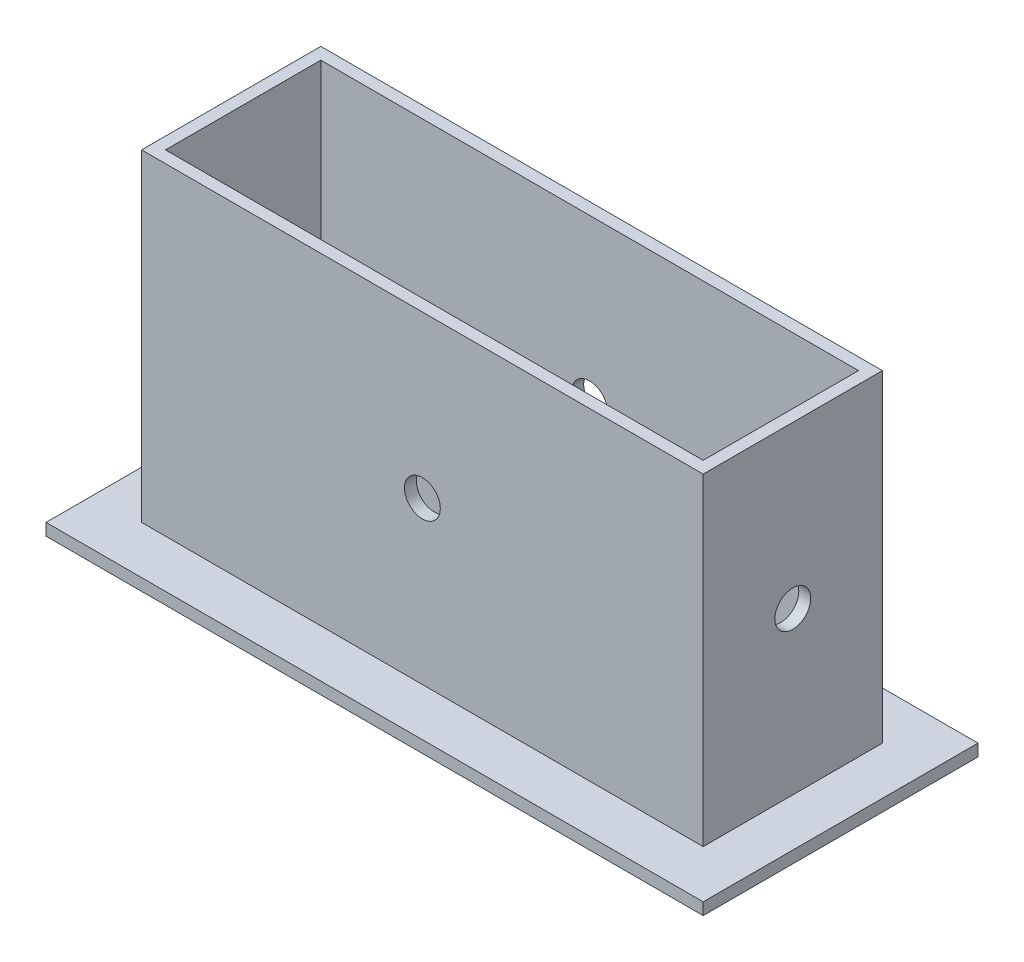
ISO-10303-21;
HEADER;
FILE_DESCRIPTION(('STEP AP214'),'2;1');
FILE_NAME('part.step','',(''),(''),'','','');
FILE_SCHEMA(('AUTOMOTIVE_DESIGN { 1 0 10303 214 1 1 1 1 }'));
ENDSEC;
DATA;
#1=APPLICATION_CONTEXT('core data for automotive mechanical design processes');
#2=APPLICATION_PROTOCOL_DEFINITION('international standard','automotive_design',2000,#1);
#3=PRODUCT_CONTEXT('',#1,'mechanical');
#4=PRODUCT('Part','Part','',(#3));
#5=PRODUCT_RELATED_PRODUCT_CATEGORY('part','',(#4));
#6=PRODUCT_DEFINITION_FORMATION('','',#4);
#7=PRODUCT_DEFINITION_CONTEXT('part definition',#1,'design');
#8=PRODUCT_DEFINITION('design','',#6,#7);
#9=PRODUCT_DEFINITION_SHAPE('','',#8);
#10=(LENGTH_UNIT() NAMED_UNIT(*) SI_UNIT(.MILLI.,.METRE.));
#11=(NAMED_UNIT(*) PLANE_ANGLE_UNIT() SI_UNIT($,.RADIAN.));
#12=(NAMED_UNIT(*) SI_UNIT($,.STERADIAN.) SOLID_ANGLE_UNIT());
#13=UNCERTAINTY_MEASURE_WITH_UNIT(LENGTH_MEASURE(1.E-05),#10,'distance_accuracy_value','');
#14=(GEOMETRIC_REPRESENTATION_CONTEXT(3) GLOBAL_UNCERTAINTY_ASSIGNED_CONTEXT((#13)) GLOBAL_UNIT_ASSIGNED_CONTEXT((#10,
#11,#12)) REPRESENTATION_CONTEXT('',''));
#15=CARTESIAN_POINT('',(0.,0.,0.));
#16=DIRECTION('',(0.,0.,1.));
#17=DIRECTION('',(1.,0.,0.));
#18=AXIS2_PLACEMENT_3D('',#15,#16,#17);
#19=CARTESIAN_POINT('',(-23.5,13.5,15.));
#20=DIRECTION('',(1.,0.,0.));
#21=DIRECTION('',(0.,1.,0.));
#22=AXIS2_PLACEMENT_3D('',#19,#20,#21);
#23=PLANE('',#22);
#24=CARTESIAN_POINT('',(-23.5,0.,7.5));
#25=DIRECTION('',(-1.,0.,0.));
#26=DIRECTION('',(0.,-1.,0.));
#27=AXIS2_PLACEMENT_3D('',#24,#25,#26);
#28=CIRCLE('',#27,1.5);
#29=CARTESIAN_POINT('',(-23.5,-1.5,7.5));
#30=VERTEX_POINT('',#29);
#31=EDGE_CURVE('E314',#30,#30,#28,.T.);
#32=ORIENTED_EDGE('',*,*,#31,.F.);
#33=EDGE_LOOP('',(#32));
#34=FACE_BOUND('',#33,.T.);
#35=DIRECTION('',(0.,-1.,0.));
#36=VECTOR('',#35,1.);
#37=CARTESIAN_POINT('',(-23.5,13.5,0.));
#38=LINE('',#37,#36);
#39=CARTESIAN_POINT('',(-23.5,13.5,0.));
#40=VERTEX_POINT('',#39);
#41=CARTESIAN_POINT('',(-23.5,-13.5,0.));
#42=VERTEX_POINT('',#41);
#43=EDGE_CURVE('E146',#40,#42,#38,.T.);
#44=ORIENTED_EDGE('',*,*,#43,.T.);
#45=DIRECTION('',(0.,0.,-1.));
#46=VECTOR('',#45,1.);
#47=CARTESIAN_POINT('',(-23.5,-13.5,15.));
#48=LINE('',#47,#46);
#49=CARTESIAN_POINT('',(-23.5,-13.5,15.));
#50=VERTEX_POINT('',#49);
#51=EDGE_CURVE('E11',#50,#42,#48,.T.);
#52=ORIENTED_EDGE('',*,*,#51,.F.);
#53=DIRECTION('',(0.,-1.,0.));
#54=VECTOR('',#53,1.);
#55=CARTESIAN_POINT('',(-23.5,13.5,15.));
#56=LINE('',#55,#54);
#57=CARTESIAN_POINT('',(-23.5,13.5,15.));
#58=VERTEX_POINT('',#57);
#59=EDGE_CURVE('E87',#58,#50,#56,.T.);
#60=ORIENTED_EDGE('',*,*,#59,.F.);
#61=DIRECTION('',(0.,0.,-1.));
#62=VECTOR('',#61,1.);
#63=CARTESIAN_POINT('',(-23.5,13.5,15.));
#64=LINE('',#63,#62);
#65=EDGE_CURVE('E242',#58,#40,#64,.T.);
#66=ORIENTED_EDGE('',*,*,#65,.T.);
#67=EDGE_LOOP('',(#44,#52,#60,#66));
#68=FACE_BOUND('',#67,.T.);
#69=ADVANCED_FACE('F38',(#34,#68),#23,.F.);
#70=CARTESIAN_POINT('',(23.5,13.5,15.));
#71=DIRECTION('',(-1.,0.,0.));
#72=DIRECTION('',(0.,-1.,0.));
#73=AXIS2_PLACEMENT_3D('',#70,#71,#72);
#74=PLANE('',#73);
#75=CARTESIAN_POINT('',(23.5,0.,7.5));
#76=DIRECTION('',(-1.,0.,0.));
#77=DIRECTION('',(0.,-1.,0.));
#78=AXIS2_PLACEMENT_3D('',#75,#76,#77);
#79=CIRCLE('',#78,1.5);
#80=CARTESIAN_POINT('',(23.5,-1.5,7.5));
#81=VERTEX_POINT('',#80);
#82=EDGE_CURVE('E433',#81,#81,#79,.T.);
#83=ORIENTED_EDGE('',*,*,#82,.T.);
#84=EDGE_LOOP('',(#83));
#85=FACE_BOUND('',#84,.T.);
#86=DIRECTION('',(0.,1.,0.));
#87=VECTOR('',#86,1.);
#88=CARTESIAN_POINT('',(23.5,13.5,0.));
#89=LINE('',#88,#87);
#90=CARTESIAN_POINT('',(23.5,-13.5,0.));
#91=VERTEX_POINT('',#90);
#92=CARTESIAN_POINT('',(23.5,13.5,0.));
#93=VERTEX_POINT('',#92);
#94=EDGE_CURVE('E249',#91,#93,#89,.T.);
#95=ORIENTED_EDGE('',*,*,#94,.T.);
#96=DIRECTION('',(0.,0.,-1.));
#97=VECTOR('',#96,1.);
#98=CARTESIAN_POINT('',(23.5,13.5,15.));
#99=LINE('',#98,#97);
#100=CARTESIAN_POINT('',(23.5,13.5,15.));
#101=VERTEX_POINT('',#100);
#102=EDGE_CURVE('E256',#101,#93,#99,.T.);
#103=ORIENTED_EDGE('',*,*,#102,.F.);
#104=DIRECTION('',(0.,1.,0.));
#105=VECTOR('',#104,1.);
#106=CARTESIAN_POINT('',(23.5,13.5,15.));
#107=LINE('',#106,#105);
#108=CARTESIAN_POINT('',(23.5,-13.5,15.));
#109=VERTEX_POINT('',#108);
#110=EDGE_CURVE('E237',#109,#101,#107,.T.);
#111=ORIENTED_EDGE('',*,*,#110,.F.);
#112=DIRECTION('',(0.,0.,-1.));
#113=VECTOR('',#112,1.);
#114=CARTESIAN_POINT('',(23.5,-13.5,15.));
#115=LINE('',#114,#113);
#116=EDGE_CURVE('E47',#109,#91,#115,.T.);
#117=ORIENTED_EDGE('',*,*,#116,.T.);
#118=EDGE_LOOP('',(#95,#103,#111,#117));
#119=FACE_BOUND('',#118,.T.);
#120=ADVANCED_FACE('F304',(#85,#119),#74,.F.);
#121=CARTESIAN_POINT('',(-23.5,13.5,15.));
#122=DIRECTION('',(0.,-1.,0.));
#123=DIRECTION('',(1.,0.,0.));
#124=AXIS2_PLACEMENT_3D('',#121,#122,#123);
#125=PLANE('',#124);
#126=DIRECTION('',(1.,0.,0.));
#127=VECTOR('',#126,1.);
#128=CARTESIAN_POINT('',(-22.5,13.5,14.));
#129=LINE('',#128,#127);
#130=CARTESIAN_POINT('',(-22.5,13.5,14.));
#131=VERTEX_POINT('',#130);
#132=CARTESIAN_POINT('',(22.5,13.5,14.));
#133=VERTEX_POINT('',#132);
#134=EDGE_CURVE('E215',#131,#133,#129,.T.);
#135=ORIENTED_EDGE('',*,*,#134,.F.);
#136=DIRECTION('',(0.,0.,1.));
#137=VECTOR('',#136,1.);
#138=CARTESIAN_POINT('',(-22.5,13.5,1.));
#139=LINE('',#138,#137);
#140=CARTESIAN_POINT('',(-22.5,13.5,1.));
#141=VERTEX_POINT('',#140);
#142=EDGE_CURVE('E55',#141,#131,#139,.T.);
#143=ORIENTED_EDGE('',*,*,#142,.F.);
#144=DIRECTION('',(-1.,0.,0.));
#145=VECTOR('',#144,1.);
#146=CARTESIAN_POINT('',(-22.5,13.5,1.));
#147=LINE('',#146,#145);
#148=CARTESIAN_POINT('',(22.5,13.5,1.));
#149=VERTEX_POINT('',#148);
#150=EDGE_CURVE('E144',#149,#141,#147,.T.);
#151=ORIENTED_EDGE('',*,*,#150,.F.);
#152=DIRECTION('',(0.,0.,-1.));
#153=VECTOR('',#152,1.);
#154=CARTESIAN_POINT('',(22.5,13.5,1.));
#155=LINE('',#154,#153);
#156=EDGE_CURVE('E219',#133,#149,#155,.T.);
#157=ORIENTED_EDGE('',*,*,#156,.F.);
#158=EDGE_LOOP('',(#135,#143,#151,#157));
#159=FACE_BOUND('',#158,.T.);
#160=DIRECTION('',(-1.,0.,0.));
#161=VECTOR('',#160,1.);
#162=CARTESIAN_POINT('',(-23.5,13.5,0.));
#163=LINE('',#162,#161);
#164=EDGE_CURVE('E82',#93,#40,#163,.T.);
#165=ORIENTED_EDGE('',*,*,#164,.T.);
#166=ORIENTED_EDGE('',*,*,#65,.F.);
#167=DIRECTION('',(-1.,0.,0.));
#168=VECTOR('',#167,1.);
#169=CARTESIAN_POINT('',(-23.5,13.5,15.));
#170=LINE('',#169,#168);
#171=EDGE_CURVE('E64',#101,#58,#170,.T.);
#172=ORIENTED_EDGE('',*,*,#171,.F.);
#173=ORIENTED_EDGE('',*,*,#102,.T.);
#174=EDGE_LOOP('',(#165,#166,#172,#173));
#175=FACE_BOUND('',#174,.T.);
#176=ADVANCED_FACE('F309',(#159,#175),#125,.F.);
#177=CARTESIAN_POINT('',(0.,0.,15.));
#178=DIRECTION('',(0.,0.,1.));
#179=DIRECTION('',(1.,0.,0.));
#180=AXIS2_PLACEMENT_3D('',#177,#178,#179);
#181=PLANE('',#180);
#182=CARTESIAN_POINT('',(0.,0.,15.));
#183=DIRECTION('',(0.,0.,1.));
#184=DIRECTION('',(1.,0.,0.));
#185=AXIS2_PLACEMENT_3D('',#182,#183,#184);
#186=CIRCLE('',#185,1.5);
#187=CARTESIAN_POINT('',(1.5,0.,15.));
#188=VERTEX_POINT('',#187);
#189=EDGE_CURVE('E264',#188,#188,#186,.T.);
#190=ORIENTED_EDGE('',*,*,#189,.F.);
#191=EDGE_LOOP('',(#190));
#192=FACE_BOUND('',#191,.T.);
#193=ORIENTED_EDGE('',*,*,#59,.T.);
#194=DIRECTION('',(1.,0.,0.));
#195=VECTOR('',#194,1.);
#196=CARTESIAN_POINT('',(-23.5,-13.5,15.));
#197=LINE('',#196,#195);
#198=EDGE_CURVE('E234',#50,#109,#197,.T.);
#199=ORIENTED_EDGE('',*,*,#198,.T.);
#200=ORIENTED_EDGE('',*,*,#110,.T.);
#201=ORIENTED_EDGE('',*,*,#171,.T.);
#202=EDGE_LOOP('',(#193,#199,#200,#201));
#203=FACE_BOUND('',#202,.T.);
#204=ADVANCED_FACE('F323',(#192,#203),#181,.T.);
#205=CARTESIAN_POINT('',(0.,0.,0.));
#206=DIRECTION('',(0.,0.,1.));
#207=DIRECTION('',(1.,0.,0.));
#208=AXIS2_PLACEMENT_3D('',#205,#206,#207);
#209=PLANE('',#208);
#210=CARTESIAN_POINT('',(0.,0.,0.));
#211=DIRECTION('',(0.,0.,1.));
#212=DIRECTION('',(1.,0.,0.));
#213=AXIS2_PLACEMENT_3D('',#210,#211,#212);
#214=CIRCLE('',#213,1.5);
#215=CARTESIAN_POINT('',(1.5,0.,0.));
#216=VERTEX_POINT('',#215);
#217=EDGE_CURVE('E157',#216,#216,#214,.T.);
#218=ORIENTED_EDGE('',*,*,#217,.T.);
#219=EDGE_LOOP('',(#218));
#220=FACE_BOUND('',#219,.T.);
#221=ORIENTED_EDGE('',*,*,#43,.F.);
#222=ORIENTED_EDGE('',*,*,#164,.F.);
#223=ORIENTED_EDGE('',*,*,#94,.F.);
#224=DIRECTION('',(1.,0.,0.));
#225=VECTOR('',#224,1.);
#226=CARTESIAN_POINT('',(-23.5,-13.5,0.));
#227=LINE('',#226,#225);
#228=EDGE_CURVE('E245',#42,#91,#227,.T.);
#229=ORIENTED_EDGE('',*,*,#228,.F.);
#230=EDGE_LOOP('',(#221,#222,#223,#229));
#231=FACE_BOUND('',#230,.T.);
#232=ADVANCED_FACE('F284',(#220,#231),#209,.F.);
#233=CARTESIAN_POINT('',(-22.5,-13.5,1.));
#234=DIRECTION('',(-1.,0.,0.));
#235=DIRECTION('',(0.,-1.,0.));
#236=AXIS2_PLACEMENT_3D('',#233,#234,#235);
#237=PLANE('',#236);
#238=CARTESIAN_POINT('',(-22.5,0.,7.5));
#239=DIRECTION('',(-1.,0.,0.));
#240=DIRECTION('',(0.,-1.,0.));
#241=AXIS2_PLACEMENT_3D('',#238,#239,#240);
#242=CIRCLE('',#241,1.5);
#243=CARTESIAN_POINT('',(-22.5,-1.5,7.5));
#244=VERTEX_POINT('',#243);
#245=EDGE_CURVE('E272',#244,#244,#242,.T.);
#246=ORIENTED_EDGE('',*,*,#245,.T.);
#247=EDGE_LOOP('',(#246));
#248=FACE_BOUND('',#247,.T.);
#249=ORIENTED_EDGE('',*,*,#142,.T.);
#250=DIRECTION('',(0.,1.,0.));
#251=VECTOR('',#250,1.);
#252=CARTESIAN_POINT('',(-22.5,-13.5,14.));
#253=LINE('',#252,#251);
#254=CARTESIAN_POINT('',(-22.5,-14.5,14.));
#255=VERTEX_POINT('',#254);
#256=EDGE_CURVE('E152',#255,#131,#253,.T.);
#257=ORIENTED_EDGE('',*,*,#256,.F.);
#258=DIRECTION('',(0.,0.,-1.));
#259=VECTOR('',#258,1.);
#260=CARTESIAN_POINT('',(-22.5,-14.5,14.));
#261=LINE('',#260,#259);
#262=CARTESIAN_POINT('',(-22.5,-14.5,1.));
#263=VERTEX_POINT('',#262);
#264=EDGE_CURVE('E150',#255,#263,#261,.T.);
#265=ORIENTED_EDGE('',*,*,#264,.T.);
#266=DIRECTION('',(0.,1.,0.));
#267=VECTOR('',#266,1.);
#268=CARTESIAN_POINT('',(-22.5,-13.5,1.));
#269=LINE('',#268,#267);
#270=EDGE_CURVE('E137',#263,#141,#269,.T.);
#271=ORIENTED_EDGE('',*,*,#270,.T.);
#272=EDGE_LOOP('',(#249,#257,#265,#271));
#273=FACE_BOUND('',#272,.T.);
#274=ADVANCED_FACE('F151',(#248,#273),#237,.F.);
#275=CARTESIAN_POINT('',(-22.5,-13.5,1.));
#276=DIRECTION('',(0.,0.,-1.));
#277=DIRECTION('',(-1.,0.,0.));
#278=AXIS2_PLACEMENT_3D('',#275,#276,#277);
#279=PLANE('',#278);
#280=CARTESIAN_POINT('',(0.,0.,1.));
#281=DIRECTION('',(0.,0.,-1.));
#282=DIRECTION('',(-1.,0.,0.));
#283=AXIS2_PLACEMENT_3D('',#280,#281,#282);
#284=CIRCLE('',#283,1.5);
#285=CARTESIAN_POINT('',(-1.5,0.,1.));
#286=VERTEX_POINT('',#285);
#287=EDGE_CURVE('E263',#286,#286,#284,.T.);
#288=ORIENTED_EDGE('',*,*,#287,.T.);
#289=EDGE_LOOP('',(#288));
#290=FACE_BOUND('',#289,.T.);
#291=ORIENTED_EDGE('',*,*,#150,.T.);
#292=ORIENTED_EDGE('',*,*,#270,.F.);
#293=DIRECTION('',(1.,0.,0.));
#294=VECTOR('',#293,1.);
#295=CARTESIAN_POINT('',(-22.5,-14.5,1.));
#296=LINE('',#295,#294);
#297=CARTESIAN_POINT('',(22.5,-14.5,1.));
#298=VERTEX_POINT('',#297);
#299=EDGE_CURVE('E141',#263,#298,#296,.T.);
#300=ORIENTED_EDGE('',*,*,#299,.T.);
#301=DIRECTION('',(0.,1.,0.));
#302=VECTOR('',#301,1.);
#303=CARTESIAN_POINT('',(22.5,-13.5,1.));
#304=LINE('',#303,#302);
#305=EDGE_CURVE('E147',#298,#149,#304,.T.);
#306=ORIENTED_EDGE('',*,*,#305,.T.);
#307=EDGE_LOOP('',(#291,#292,#300,#306));
#308=FACE_BOUND('',#307,.T.);
#309=ADVANCED_FACE('F139',(#290,#308),#279,.F.);
#310=CARTESIAN_POINT('',(22.5,-13.5,1.));
#311=DIRECTION('',(1.,0.,0.));
#312=DIRECTION('',(0.,1.,0.));
#313=AXIS2_PLACEMENT_3D('',#310,#311,#312);
#314=PLANE('',#313);
#315=CARTESIAN_POINT('',(22.5,0.,7.5));
#316=DIRECTION('',(1.,0.,0.));
#317=DIRECTION('',(0.,1.,0.));
#318=AXIS2_PLACEMENT_3D('',#315,#316,#317);
#319=CIRCLE('',#318,1.5);
#320=CARTESIAN_POINT('',(22.5,1.5,7.5));
#321=VERTEX_POINT('',#320);
#322=EDGE_CURVE('E41',#321,#321,#319,.T.);
#323=ORIENTED_EDGE('',*,*,#322,.T.);
#324=EDGE_LOOP('',(#323));
#325=FACE_BOUND('',#324,.T.);
#326=ORIENTED_EDGE('',*,*,#156,.T.);
#327=ORIENTED_EDGE('',*,*,#305,.F.);
#328=DIRECTION('',(0.,0.,1.));
#329=VECTOR('',#328,1.);
#330=CARTESIAN_POINT('',(22.5,-14.5,14.));
#331=LINE('',#330,#329);
#332=CARTESIAN_POINT('',(22.5,-14.5,14.));
#333=VERTEX_POINT('',#332);
#334=EDGE_CURVE('E161',#298,#333,#331,.T.);
#335=ORIENTED_EDGE('',*,*,#334,.T.);
#336=DIRECTION('',(0.,1.,0.));
#337=VECTOR('',#336,1.);
#338=CARTESIAN_POINT('',(22.5,-13.5,14.));
#339=LINE('',#338,#337);
#340=EDGE_CURVE('E227',#333,#133,#339,.T.);
#341=ORIENTED_EDGE('',*,*,#340,.T.);
#342=EDGE_LOOP('',(#326,#327,#335,#341));
#343=FACE_BOUND('',#342,.T.);
#344=ADVANCED_FACE('F346',(#325,#343),#314,.F.);
#345=CARTESIAN_POINT('',(-22.5,-13.5,14.));
#346=DIRECTION('',(0.,0.,1.));
#347=DIRECTION('',(1.,0.,0.));
#348=AXIS2_PLACEMENT_3D('',#345,#346,#347);
#349=PLANE('',#348);
#350=CARTESIAN_POINT('',(0.,0.,14.));
#351=DIRECTION('',(0.,0.,1.));
#352=DIRECTION('',(1.,0.,0.));
#353=AXIS2_PLACEMENT_3D('',#350,#351,#352);
#354=CIRCLE('',#353,1.5);
#355=CARTESIAN_POINT('',(1.5,0.,14.));
#356=VERTEX_POINT('',#355);
#357=EDGE_CURVE('E260',#356,#356,#354,.T.);
#358=ORIENTED_EDGE('',*,*,#357,.T.);
#359=EDGE_LOOP('',(#358));
#360=FACE_BOUND('',#359,.T.);
#361=ORIENTED_EDGE('',*,*,#134,.T.);
#362=ORIENTED_EDGE('',*,*,#340,.F.);
#363=DIRECTION('',(-1.,0.,0.));
#364=VECTOR('',#363,1.);
#365=CARTESIAN_POINT('',(-22.5,-14.5,14.));
#366=LINE('',#365,#364);
#367=EDGE_CURVE('E165',#333,#255,#366,.T.);
#368=ORIENTED_EDGE('',*,*,#367,.T.);
#369=ORIENTED_EDGE('',*,*,#256,.T.);
#370=EDGE_LOOP('',(#361,#362,#368,#369));
#371=FACE_BOUND('',#370,.T.);
#372=ADVANCED_FACE('F343',(#360,#371),#349,.F.);
#373=CARTESIAN_POINT('',(0.,-13.5,0.));
#374=DIRECTION('',(0.,-1.,0.));
#375=DIRECTION('',(1.,0.,0.));
#376=AXIS2_PLACEMENT_3D('',#373,#374,#375);
#377=PLANE('',#376);
#378=DIRECTION('',(0.,0.,-1.));
#379=VECTOR('',#378,1.);
#380=CARTESIAN_POINT('',(-27.5,-13.5,19.));
#381=LINE('',#380,#379);
#382=CARTESIAN_POINT('',(-27.5,-13.5,19.));
#383=VERTEX_POINT('',#382);
#384=CARTESIAN_POINT('',(-27.5,-13.5,-4.));
#385=VERTEX_POINT('',#384);
#386=EDGE_CURVE('E171',#383,#385,#381,.T.);
#387=ORIENTED_EDGE('',*,*,#386,.F.);
#388=DIRECTION('',(-1.,0.,0.));
#389=VECTOR('',#388,1.);
#390=CARTESIAN_POINT('',(-27.5,-13.5,19.));
#391=LINE('',#390,#389);
#392=CARTESIAN_POINT('',(27.5,-13.5,19.));
#393=VERTEX_POINT('',#392);
#394=EDGE_CURVE('E177',#393,#383,#391,.T.);
#395=ORIENTED_EDGE('',*,*,#394,.F.);
#396=DIRECTION('',(0.,0.,1.));
#397=VECTOR('',#396,1.);
#398=CARTESIAN_POINT('',(27.5,-13.5,19.));
#399=LINE('',#398,#397);
#400=CARTESIAN_POINT('',(27.5,-13.5,-4.));
#401=VERTEX_POINT('',#400);
#402=EDGE_CURVE('E193',#401,#393,#399,.T.);
#403=ORIENTED_EDGE('',*,*,#402,.F.);
#404=DIRECTION('',(1.,0.,0.));
#405=VECTOR('',#404,1.);
#406=CARTESIAN_POINT('',(-27.5,-13.5,-4.));
#407=LINE('',#406,#405);
#408=EDGE_CURVE('E190',#385,#401,#407,.T.);
#409=ORIENTED_EDGE('',*,*,#408,.F.);
#410=EDGE_LOOP('',(#387,#395,#403,#409));
#411=FACE_BOUND('',#410,.T.);
#412=ORIENTED_EDGE('',*,*,#51,.T.);
#413=ORIENTED_EDGE('',*,*,#228,.T.);
#414=ORIENTED_EDGE('',*,*,#116,.F.);
#415=ORIENTED_EDGE('',*,*,#198,.F.);
#416=EDGE_LOOP('',(#412,#413,#414,#415));
#417=FACE_BOUND('',#416,.T.);
#418=ADVANCED_FACE('F321',(#411,#417),#377,.F.);
#419=CARTESIAN_POINT('',(0.,-14.5,0.));
#420=DIRECTION('',(0.,-1.,0.));
#421=DIRECTION('',(1.,0.,0.));
#422=AXIS2_PLACEMENT_3D('',#419,#420,#421);
#423=PLANE('',#422);
#424=DIRECTION('',(0.,0.,-1.));
#425=VECTOR('',#424,1.);
#426=CARTESIAN_POINT('',(-27.5,-14.5,19.));
#427=LINE('',#426,#425);
#428=CARTESIAN_POINT('',(-27.5,-14.5,19.));
#429=VERTEX_POINT('',#428);
#430=CARTESIAN_POINT('',(-27.5,-14.5,-4.));
#431=VERTEX_POINT('',#430);
#432=EDGE_CURVE('E172',#429,#431,#427,.T.);
#433=ORIENTED_EDGE('',*,*,#432,.T.);
#434=DIRECTION('',(1.,0.,0.));
#435=VECTOR('',#434,1.);
#436=CARTESIAN_POINT('',(-27.5,-14.5,-4.));
#437=LINE('',#436,#435);
#438=CARTESIAN_POINT('',(27.5,-14.5,-4.));
#439=VERTEX_POINT('',#438);
#440=EDGE_CURVE('E176',#431,#439,#437,.T.);
#441=ORIENTED_EDGE('',*,*,#440,.T.);
#442=DIRECTION('',(0.,0.,1.));
#443=VECTOR('',#442,1.);
#444=CARTESIAN_POINT('',(27.5,-14.5,19.));
#445=LINE('',#444,#443);
#446=CARTESIAN_POINT('',(27.5,-14.5,19.));
#447=VERTEX_POINT('',#446);
#448=EDGE_CURVE('E180',#439,#447,#445,.T.);
#449=ORIENTED_EDGE('',*,*,#448,.T.);
#450=DIRECTION('',(-1.,0.,0.));
#451=VECTOR('',#450,1.);
#452=CARTESIAN_POINT('',(-27.5,-14.5,19.));
#453=LINE('',#452,#451);
#454=EDGE_CURVE('E183',#447,#429,#453,.T.);
#455=ORIENTED_EDGE('',*,*,#454,.T.);
#456=EDGE_LOOP('',(#433,#441,#449,#455));
#457=FACE_BOUND('',#456,.T.);
#458=ORIENTED_EDGE('',*,*,#299,.F.);
#459=ORIENTED_EDGE('',*,*,#264,.F.);
#460=ORIENTED_EDGE('',*,*,#367,.F.);
#461=ORIENTED_EDGE('',*,*,#334,.F.);
#462=EDGE_LOOP('',(#458,#459,#460,#461));
#463=FACE_BOUND('',#462,.T.);
#464=ADVANCED_FACE('F159',(#457,#463),#423,.T.);
#465=CARTESIAN_POINT('',(-27.5,-14.5,19.));
#466=DIRECTION('',(1.,0.,0.));
#467=DIRECTION('',(0.,0.,-1.));
#468=AXIS2_PLACEMENT_3D('',#465,#466,#467);
#469=PLANE('',#468);
#470=ORIENTED_EDGE('',*,*,#386,.T.);
#471=DIRECTION('',(0.,1.,0.));
#472=VECTOR('',#471,1.);
#473=CARTESIAN_POINT('',(-27.5,-14.5,-4.));
#474=LINE('',#473,#472);
#475=EDGE_CURVE('E209',#431,#385,#474,.T.);
#476=ORIENTED_EDGE('',*,*,#475,.F.);
#477=ORIENTED_EDGE('',*,*,#432,.F.);
#478=DIRECTION('',(0.,1.,0.));
#479=VECTOR('',#478,1.);
#480=CARTESIAN_POINT('',(-27.5,-14.5,19.));
#481=LINE('',#480,#479);
#482=EDGE_CURVE('E186',#429,#383,#481,.T.);
#483=ORIENTED_EDGE('',*,*,#482,.T.);
#484=EDGE_LOOP('',(#470,#476,#477,#483));
#485=FACE_BOUND('',#484,.T.);
#486=ADVANCED_FACE('F353',(#485),#469,.F.);
#487=CARTESIAN_POINT('',(-27.5,-14.5,-4.));
#488=DIRECTION('',(0.,0.,1.));
#489=DIRECTION('',(1.,0.,0.));
#490=AXIS2_PLACEMENT_3D('',#487,#488,#489);
#491=PLANE('',#490);
#492=ORIENTED_EDGE('',*,*,#408,.T.);
#493=DIRECTION('',(0.,1.,0.));
#494=VECTOR('',#493,1.);
#495=CARTESIAN_POINT('',(27.5,-14.5,-4.));
#496=LINE('',#495,#494);
#497=EDGE_CURVE('E205',#439,#401,#496,.T.);
#498=ORIENTED_EDGE('',*,*,#497,.F.);
#499=ORIENTED_EDGE('',*,*,#440,.F.);
#500=ORIENTED_EDGE('',*,*,#475,.T.);
#501=EDGE_LOOP('',(#492,#498,#499,#500));
#502=FACE_BOUND('',#501,.T.);
#503=ADVANCED_FACE('F356',(#502),#491,.F.);
#504=CARTESIAN_POINT('',(27.5,-14.5,19.));
#505=DIRECTION('',(-1.,0.,0.));
#506=DIRECTION('',(0.,0.,1.));
#507=AXIS2_PLACEMENT_3D('',#504,#505,#506);
#508=PLANE('',#507);
#509=ORIENTED_EDGE('',*,*,#402,.T.);
#510=DIRECTION('',(0.,1.,0.));
#511=VECTOR('',#510,1.);
#512=CARTESIAN_POINT('',(27.5,-14.5,19.));
#513=LINE('',#512,#511);
#514=EDGE_CURVE('E201',#447,#393,#513,.T.);
#515=ORIENTED_EDGE('',*,*,#514,.F.);
#516=ORIENTED_EDGE('',*,*,#448,.F.);
#517=ORIENTED_EDGE('',*,*,#497,.T.);
#518=EDGE_LOOP('',(#509,#515,#516,#517));
#519=FACE_BOUND('',#518,.T.);
#520=ADVANCED_FACE('F360',(#519),#508,.F.);
#521=CARTESIAN_POINT('',(-27.5,-14.5,19.));
#522=DIRECTION('',(0.,0.,-1.));
#523=DIRECTION('',(-1.,0.,0.));
#524=AXIS2_PLACEMENT_3D('',#521,#522,#523);
#525=PLANE('',#524);
#526=ORIENTED_EDGE('',*,*,#394,.T.);
#527=ORIENTED_EDGE('',*,*,#482,.F.);
#528=ORIENTED_EDGE('',*,*,#454,.F.);
#529=ORIENTED_EDGE('',*,*,#514,.T.);
#530=EDGE_LOOP('',(#526,#527,#528,#529));
#531=FACE_BOUND('',#530,.T.);
#532=ADVANCED_FACE('F300',(#531),#525,.F.);
#533=CARTESIAN_POINT('',(0.,0.,-2.));
#534=DIRECTION('',(0.,0.,1.));
#535=DIRECTION('',(1.,0.,0.));
#536=AXIS2_PLACEMENT_3D('',#533,#534,#535);
#537=CYLINDRICAL_SURFACE('',#536,1.5);
#538=ORIENTED_EDGE('',*,*,#189,.T.);
#539=EDGE_LOOP('',(#538));
#540=FACE_BOUND('',#539,.T.);
#541=ORIENTED_EDGE('',*,*,#357,.F.);
#542=EDGE_LOOP('',(#541));
#543=FACE_BOUND('',#542,.T.);
#544=ADVANCED_FACE('F290',(#540,#543),#537,.F.);
#545=ORIENTED_EDGE('',*,*,#287,.F.);
#546=EDGE_LOOP('',(#545));
#547=FACE_BOUND('',#546,.T.);
#548=ORIENTED_EDGE('',*,*,#217,.F.);
#549=EDGE_LOOP('',(#548));
#550=FACE_BOUND('',#549,.T.);
#551=ADVANCED_FACE('F287',(#547,#550),#537,.F.);
#552=CARTESIAN_POINT('',(23.5,0.,7.5));
#553=DIRECTION('',(-1.,0.,0.));
#554=DIRECTION('',(0.,-1.,0.));
#555=AXIS2_PLACEMENT_3D('',#552,#553,#554);
#556=CYLINDRICAL_SURFACE('',#555,1.5);
#557=ORIENTED_EDGE('',*,*,#82,.F.);
#558=EDGE_LOOP('',(#557));
#559=FACE_BOUND('',#558,.T.);
#560=ORIENTED_EDGE('',*,*,#322,.F.);
#561=EDGE_LOOP('',(#560));
#562=FACE_BOUND('',#561,.T.);
#563=ADVANCED_FACE('F289',(#559,#562),#556,.F.);
#564=ORIENTED_EDGE('',*,*,#31,.T.);
#565=EDGE_LOOP('',(#564));
#566=FACE_BOUND('',#565,.T.);
#567=ORIENTED_EDGE('',*,*,#245,.F.);
#568=EDGE_LOOP('',(#567));
#569=FACE_BOUND('',#568,.T.);
#570=ADVANCED_FACE('F297',(#566,#569),#556,.F.);
#571=CLOSED_SHELL('',(#69,#120,#176,#204,#232,#274,#309,#344,#372,#418,#464,#486,#503,#520,#532,
#544,#551,#563,#570));
#572=MANIFOLD_SOLID_BREP('B2',#571);
#573=ADVANCED_BREP_SHAPE_REPRESENTATION('',(#18,#572),#14);
#574=SHAPE_DEFINITION_REPRESENTATION(#9,#573);
ENDSEC;
END-ISO-10303-21;
